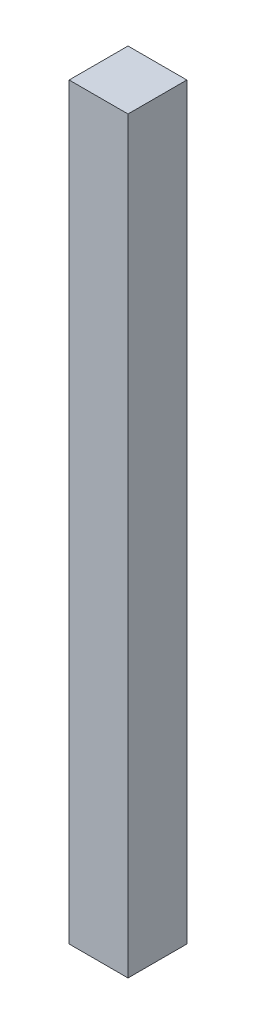
ISO-10303-21;
HEADER;
FILE_DESCRIPTION(('STEP AP214'),'2;1');
FILE_NAME('part.step','',(''),(''),'','','');
FILE_SCHEMA(('AUTOMOTIVE_DESIGN { 1 0 10303 214 1 1 1 1 }'));
ENDSEC;
DATA;
#1=APPLICATION_CONTEXT('core data for automotive mechanical design processes');
#2=APPLICATION_PROTOCOL_DEFINITION('international standard','automotive_design',2000,#1);
#3=PRODUCT_CONTEXT('',#1,'mechanical');
#4=PRODUCT('Part','Part','',(#3));
#5=PRODUCT_RELATED_PRODUCT_CATEGORY('part','',(#4));
#6=PRODUCT_DEFINITION_FORMATION('','',#4);
#7=PRODUCT_DEFINITION_CONTEXT('part definition',#1,'design');
#8=PRODUCT_DEFINITION('design','',#6,#7);
#9=PRODUCT_DEFINITION_SHAPE('','',#8);
#10=(LENGTH_UNIT() NAMED_UNIT(*) SI_UNIT(.MILLI.,.METRE.));
#11=(NAMED_UNIT(*) PLANE_ANGLE_UNIT() SI_UNIT($,.RADIAN.));
#12=(NAMED_UNIT(*) SI_UNIT($,.STERADIAN.) SOLID_ANGLE_UNIT());
#13=UNCERTAINTY_MEASURE_WITH_UNIT(LENGTH_MEASURE(1.E-05),#10,'distance_accuracy_value','');
#14=(GEOMETRIC_REPRESENTATION_CONTEXT(3) GLOBAL_UNCERTAINTY_ASSIGNED_CONTEXT((#13)) GLOBAL_UNIT_ASSIGNED_CONTEXT((#10,
#11,#12)) REPRESENTATION_CONTEXT('',''));
#15=CARTESIAN_POINT('',(0.,0.,0.));
#16=DIRECTION('',(0.,0.,1.));
#17=DIRECTION('',(1.,0.,0.));
#18=AXIS2_PLACEMENT_3D('',#15,#16,#17);
#19=CARTESIAN_POINT('',(0.,282.523472355821,0.));
#20=DIRECTION('',(1.,0.,0.));
#21=DIRECTION('',(0.,0.,-1.));
#22=AXIS2_PLACEMENT_3D('',#19,#20,#21);
#23=PLANE('',#22);
#24=DIRECTION('',(0.,0.,1.));
#25=VECTOR('',#24,1.);
#26=CARTESIAN_POINT('',(0.,254.239201108359,0.));
#27=LINE('',#26,#25);
#28=CARTESIAN_POINT('',(0.,254.239201108359,-1.48370898900296E-13));
#29=VERTEX_POINT('',#28);
#30=CARTESIAN_POINT('',(0.,254.239201108359,20.));
#31=VERTEX_POINT('',#30);
#32=EDGE_CURVE('E101',#29,#31,#27,.T.);
#33=ORIENTED_EDGE('',*,*,#32,.F.);
#34=DIRECTION('',(0.,-1.,0.));
#35=VECTOR('',#34,1.);
#36=CARTESIAN_POINT('',(0.,282.523472355821,0.));
#37=LINE('',#36,#35);
#38=CARTESIAN_POINT('',(0.,0.,0.));
#39=VERTEX_POINT('',#38);
#40=EDGE_CURVE('E92',#29,#39,#37,.T.);
#41=ORIENTED_EDGE('',*,*,#40,.T.);
#42=DIRECTION('',(0.,0.,1.));
#43=VECTOR('',#42,1.);
#44=CARTESIAN_POINT('',(0.,0.,0.));
#45=LINE('',#44,#43);
#46=CARTESIAN_POINT('',(0.,0.,20.));
#47=VERTEX_POINT('',#46);
#48=EDGE_CURVE('E83',#39,#47,#45,.T.);
#49=ORIENTED_EDGE('',*,*,#48,.T.);
#50=DIRECTION('',(0.,-1.,0.));
#51=VECTOR('',#50,1.);
#52=CARTESIAN_POINT('',(0.,282.523472355821,20.));
#53=LINE('',#52,#51);
#54=EDGE_CURVE('E75',#31,#47,#53,.T.);
#55=ORIENTED_EDGE('',*,*,#54,.F.);
#56=EDGE_LOOP('',(#33,#41,#49,#55));
#57=FACE_BOUND('',#56,.T.);
#58=ADVANCED_FACE('F33',(#57),#23,.F.);
#59=CARTESIAN_POINT('',(0.,282.523472355821,20.));
#60=DIRECTION('',(0.,0.,-1.));
#61=DIRECTION('',(-1.,0.,0.));
#62=AXIS2_PLACEMENT_3D('',#59,#60,#61);
#63=PLANE('',#62);
#64=DIRECTION('',(1.,0.,0.));
#65=VECTOR('',#64,1.);
#66=CARTESIAN_POINT('',(0.,254.239201108359,20.));
#67=LINE('',#66,#65);
#68=CARTESIAN_POINT('',(19.9999999999999,254.239201108359,20.));
#69=VERTEX_POINT('',#68);
#70=EDGE_CURVE('E37',#31,#69,#67,.T.);
#71=ORIENTED_EDGE('',*,*,#70,.F.);
#72=ORIENTED_EDGE('',*,*,#54,.T.);
#73=DIRECTION('',(1.,0.,0.));
#74=VECTOR('',#73,1.);
#75=CARTESIAN_POINT('',(0.,0.,20.));
#76=LINE('',#75,#74);
#77=CARTESIAN_POINT('',(20.,0.,20.));
#78=VERTEX_POINT('',#77);
#79=EDGE_CURVE('E78',#47,#78,#76,.T.);
#80=ORIENTED_EDGE('',*,*,#79,.T.);
#81=DIRECTION('',(0.,-1.,0.));
#82=VECTOR('',#81,1.);
#83=CARTESIAN_POINT('',(20.,282.523472355821,20.));
#84=LINE('',#83,#82);
#85=EDGE_CURVE('E69',#69,#78,#84,.T.);
#86=ORIENTED_EDGE('',*,*,#85,.F.);
#87=EDGE_LOOP('',(#71,#72,#80,#86));
#88=FACE_BOUND('',#87,.T.);
#89=ADVANCED_FACE('F77',(#88),#63,.F.);
#90=CARTESIAN_POINT('',(20.,282.523472355821,0.));
#91=DIRECTION('',(-1.,0.,0.));
#92=DIRECTION('',(0.,0.,1.));
#93=AXIS2_PLACEMENT_3D('',#90,#91,#92);
#94=PLANE('',#93);
#95=DIRECTION('',(0.,0.,-1.));
#96=VECTOR('',#95,1.);
#97=CARTESIAN_POINT('',(20.,254.239201108359,0.));
#98=LINE('',#97,#96);
#99=CARTESIAN_POINT('',(20.,254.239201108359,0.));
#100=VERTEX_POINT('',#99);
#101=EDGE_CURVE('E43',#69,#100,#98,.T.);
#102=ORIENTED_EDGE('',*,*,#101,.F.);
#103=ORIENTED_EDGE('',*,*,#85,.T.);
#104=DIRECTION('',(0.,0.,-1.));
#105=VECTOR('',#104,1.);
#106=CARTESIAN_POINT('',(20.,0.,0.));
#107=LINE('',#106,#105);
#108=CARTESIAN_POINT('',(20.,0.,0.));
#109=VERTEX_POINT('',#108);
#110=EDGE_CURVE('E89',#78,#109,#107,.T.);
#111=ORIENTED_EDGE('',*,*,#110,.T.);
#112=DIRECTION('',(0.,-1.,0.));
#113=VECTOR('',#112,1.);
#114=CARTESIAN_POINT('',(20.,282.523472355821,0.));
#115=LINE('',#114,#113);
#116=EDGE_CURVE('E99',#100,#109,#115,.T.);
#117=ORIENTED_EDGE('',*,*,#116,.F.);
#118=EDGE_LOOP('',(#102,#103,#111,#117));
#119=FACE_BOUND('',#118,.T.);
#120=ADVANCED_FACE('F106',(#119),#94,.F.);
#121=CARTESIAN_POINT('',(0.,282.523472355821,0.));
#122=DIRECTION('',(0.,0.,1.));
#123=DIRECTION('',(1.,0.,0.));
#124=AXIS2_PLACEMENT_3D('',#121,#122,#123);
#125=PLANE('',#124);
#126=DIRECTION('',(-1.,0.,0.));
#127=VECTOR('',#126,1.);
#128=CARTESIAN_POINT('',(0.,254.239201108359,0.));
#129=LINE('',#128,#127);
#130=EDGE_CURVE('E11',#100,#29,#129,.T.);
#131=ORIENTED_EDGE('',*,*,#130,.F.);
#132=ORIENTED_EDGE('',*,*,#116,.T.);
#133=DIRECTION('',(-1.,0.,0.));
#134=VECTOR('',#133,1.);
#135=CARTESIAN_POINT('',(0.,0.,0.));
#136=LINE('',#135,#134);
#137=EDGE_CURVE('E100',#109,#39,#136,.T.);
#138=ORIENTED_EDGE('',*,*,#137,.T.);
#139=ORIENTED_EDGE('',*,*,#40,.F.);
#140=EDGE_LOOP('',(#131,#132,#138,#139));
#141=FACE_BOUND('',#140,.T.);
#142=ADVANCED_FACE('F107',(#141),#125,.F.);
#143=CARTESIAN_POINT('',(0.,0.,0.));
#144=DIRECTION('',(0.,1.,0.));
#145=DIRECTION('',(0.,0.,1.));
#146=AXIS2_PLACEMENT_3D('',#143,#144,#145);
#147=PLANE('',#146);
#148=ORIENTED_EDGE('',*,*,#48,.F.);
#149=ORIENTED_EDGE('',*,*,#137,.F.);
#150=ORIENTED_EDGE('',*,*,#110,.F.);
#151=ORIENTED_EDGE('',*,*,#79,.F.);
#152=EDGE_LOOP('',(#148,#149,#150,#151));
#153=FACE_BOUND('',#152,.T.);
#154=ADVANCED_FACE('F87',(#153),#147,.F.);
#155=CARTESIAN_POINT('',(-0.300000000000189,254.239201108359,-25.6844011326087));
#156=DIRECTION('',(0.,1.,0.));
#157=DIRECTION('',(-1.,0.,0.));
#158=AXIS2_PLACEMENT_3D('',#155,#156,#157);
#159=PLANE('',#158);
#160=ORIENTED_EDGE('',*,*,#32,.T.);
#161=ORIENTED_EDGE('',*,*,#70,.T.);
#162=ORIENTED_EDGE('',*,*,#101,.T.);
#163=ORIENTED_EDGE('',*,*,#130,.T.);
#164=EDGE_LOOP('',(#160,#161,#162,#163));
#165=FACE_BOUND('',#164,.T.);
#166=ADVANCED_FACE('F35',(#165),#159,.T.);
#167=CLOSED_SHELL('',(#58,#89,#120,#142,#154,#166));
#168=MANIFOLD_SOLID_BREP('B2',#167);
#169=ADVANCED_BREP_SHAPE_REPRESENTATION('',(#18,#168),#14);
#170=SHAPE_DEFINITION_REPRESENTATION(#9,#169);
ENDSEC;
END-ISO-10303-21;
